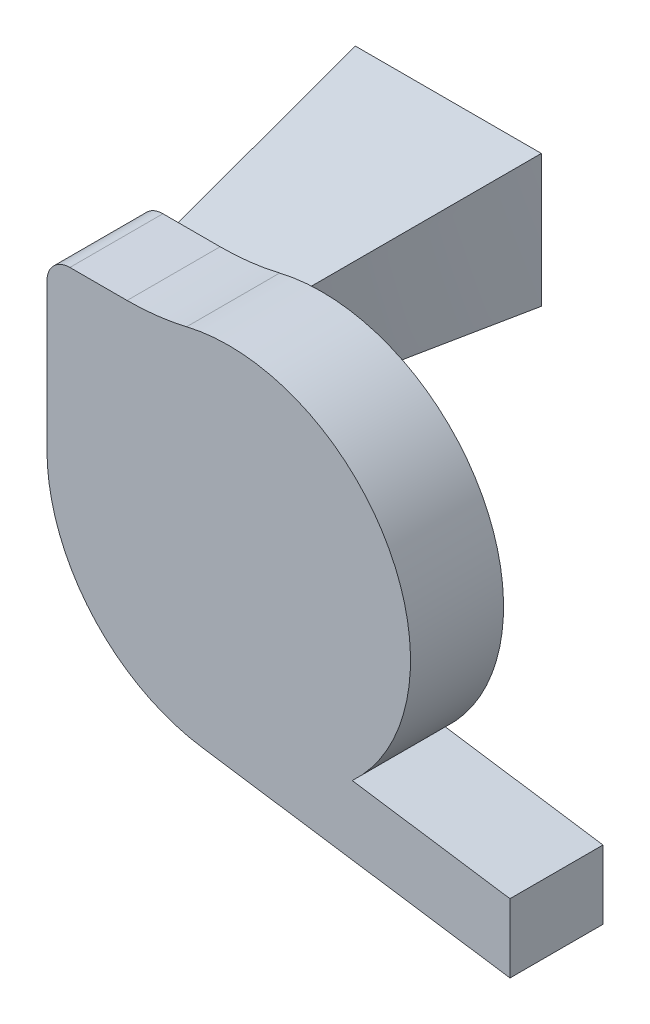
ISO-10303-21;
HEADER;
FILE_DESCRIPTION(('STEP AP214'),'2;1');
FILE_NAME('part.step','',(''),(''),'','','');
FILE_SCHEMA(('AUTOMOTIVE_DESIGN { 1 0 10303 214 1 1 1 1 }'));
ENDSEC;
DATA;
#1=APPLICATION_CONTEXT('core data for automotive mechanical design processes');
#2=APPLICATION_PROTOCOL_DEFINITION('international standard','automotive_design',2000,#1);
#3=PRODUCT_CONTEXT('',#1,'mechanical');
#4=PRODUCT('Part','Part','',(#3));
#5=PRODUCT_RELATED_PRODUCT_CATEGORY('part','',(#4));
#6=PRODUCT_DEFINITION_FORMATION('','',#4);
#7=PRODUCT_DEFINITION_CONTEXT('part definition',#1,'design');
#8=PRODUCT_DEFINITION('design','',#6,#7);
#9=PRODUCT_DEFINITION_SHAPE('','',#8);
#10=(LENGTH_UNIT() NAMED_UNIT(*) SI_UNIT(.MILLI.,.METRE.));
#11=(NAMED_UNIT(*) PLANE_ANGLE_UNIT() SI_UNIT($,.RADIAN.));
#12=(NAMED_UNIT(*) SI_UNIT($,.STERADIAN.) SOLID_ANGLE_UNIT());
#13=UNCERTAINTY_MEASURE_WITH_UNIT(LENGTH_MEASURE(1.E-05),#10,'distance_accuracy_value','');
#14=(GEOMETRIC_REPRESENTATION_CONTEXT(3) GLOBAL_UNCERTAINTY_ASSIGNED_CONTEXT((#13)) GLOBAL_UNIT_ASSIGNED_CONTEXT((#10,
#11,#12)) REPRESENTATION_CONTEXT('',''));
#15=CARTESIAN_POINT('',(0.,0.,0.));
#16=DIRECTION('',(0.,0.,1.));
#17=DIRECTION('',(1.,0.,0.));
#18=AXIS2_PLACEMENT_3D('',#15,#16,#17);
#19=CARTESIAN_POINT('',(128.,-103.,707.));
#20=DIRECTION('',(0.,0.,-1.));
#21=DIRECTION('',(-1.,0.,0.));
#22=AXIS2_PLACEMENT_3D('',#19,#20,#21);
#23=PLANE('',#22);
#24=DIRECTION('',(0.,-1.,0.));
#25=VECTOR('',#24,1.);
#26=CARTESIAN_POINT('',(521.006513991805,-418.097434556668,707.));
#27=LINE('',#26,#25);
#28=CARTESIAN_POINT('',(521.006513991806,-322.097434556668,707.));
#29=VERTEX_POINT('',#28);
#30=CARTESIAN_POINT('',(521.006513991805,-418.097434556668,707.));
#31=VERTEX_POINT('',#30);
#32=EDGE_CURVE('E267',#29,#31,#27,.T.);
#33=ORIENTED_EDGE('',*,*,#32,.T.);
#34=DIRECTION('',(-0.989169442590769,0.146778110918038,0.));
#35=VECTOR('',#34,1.);
#36=CARTESIAN_POINT('',(90.7183598268185,-354.249038418055,707.));
#37=LINE('',#36,#35);
#38=CARTESIAN_POINT('',(90.7183598268185,-354.249038418055,707.));
#39=VERTEX_POINT('',#38);
#40=EDGE_CURVE('E271',#31,#39,#37,.T.);
#41=ORIENTED_EDGE('',*,*,#40,.T.);
#42=CARTESIAN_POINT('',(128.,-103.,707.));
#43=DIRECTION('',(0.,0.,-1.));
#44=DIRECTION('',(-1.,0.,0.));
#45=AXIS2_PLACEMENT_3D('',#42,#43,#44);
#46=CIRCLE('',#45,254.);
#47=CARTESIAN_POINT('',(-126.,-103.,707.));
#48=VERTEX_POINT('',#47);
#49=EDGE_CURVE('E276',#39,#48,#46,.T.);
#50=ORIENTED_EDGE('',*,*,#49,.T.);
#51=DIRECTION('',(0.,1.,0.));
#52=VECTOR('',#51,1.);
#53=CARTESIAN_POINT('',(-126.,-103.,707.));
#54=LINE('',#53,#52);
#55=CARTESIAN_POINT('',(-126.,102.31037281145,707.));
#56=VERTEX_POINT('',#55);
#57=EDGE_CURVE('E280',#48,#56,#54,.T.);
#58=ORIENTED_EDGE('',*,*,#57,.T.);
#59=CARTESIAN_POINT('',(-94.,102.31037281145,707.));
#60=DIRECTION('',(0.,0.,-1.));
#61=DIRECTION('',(-1.,0.,0.));
#62=AXIS2_PLACEMENT_3D('',#59,#60,#61);
#63=CIRCLE('',#62,32.);
#64=CARTESIAN_POINT('',(-94.,134.31037281145,707.));
#65=VERTEX_POINT('',#64);
#66=EDGE_CURVE('E284',#56,#65,#63,.T.);
#67=ORIENTED_EDGE('',*,*,#66,.T.);
#68=DIRECTION('',(1.,0.,0.));
#69=VECTOR('',#68,1.);
#70=CARTESIAN_POINT('',(-94.,134.31037281145,707.));
#71=LINE('',#70,#69);
#72=CARTESIAN_POINT('',(-14.0739402088401,134.31037281145,707.));
#73=VERTEX_POINT('',#72);
#74=EDGE_CURVE('E288',#65,#73,#71,.T.);
#75=ORIENTED_EDGE('',*,*,#74,.T.);
#76=CARTESIAN_POINT('',(-14.07394020884,493.372243845825,707.));
#77=DIRECTION('',(0.,0.,1.));
#78=DIRECTION('',(1.,0.,0.));
#79=AXIS2_PLACEMENT_3D('',#76,#77,#78);
#80=CIRCLE('',#79,359.061871034375);
#81=CARTESIAN_POINT('',(69.1368044270006,144.08525695989,707.));
#82=VERTEX_POINT('',#81);
#83=EDGE_CURVE('E292',#73,#82,#80,.T.);
#84=ORIENTED_EDGE('',*,*,#83,.T.);
#85=CARTESIAN_POINT('',(128.,-103.,707.));
#86=DIRECTION('',(0.,0.,-1.));
#87=DIRECTION('',(-1.,0.,0.));
#88=AXIS2_PLACEMENT_3D('',#85,#86,#87);
#89=CIRCLE('',#88,254.);
#90=CARTESIAN_POINT('',(300.557862014574,-289.386116052026,707.));
#91=VERTEX_POINT('',#90);
#92=EDGE_CURVE('E237',#82,#91,#89,.T.);
#93=ORIENTED_EDGE('',*,*,#92,.T.);
#94=DIRECTION('',(0.989169442590769,-0.146778110918038,0.));
#95=VECTOR('',#94,1.);
#96=CARTESIAN_POINT('',(521.006513991806,-322.097434556668,707.));
#97=LINE('',#96,#95);
#98=EDGE_CURVE('E297',#91,#29,#97,.T.);
#99=ORIENTED_EDGE('',*,*,#98,.T.);
#100=EDGE_LOOP('',(#33,#41,#50,#58,#67,#75,#84,#93,#99));
#101=FACE_BOUND('',#100,.T.);
#102=DIRECTION('',(-1.,0.,0.));
#103=VECTOR('',#102,1.);
#104=CARTESIAN_POINT('',(44.8216487915123,-38.2997440494397,707.));
#105=LINE('',#104,#103);
#106=CARTESIAN_POINT('',(44.8216487915123,-38.2997440494397,707.));
#107=VERTEX_POINT('',#106);
#108=CARTESIAN_POINT('',(-85.1783512084866,-38.2997440494397,707.));
#109=VERTEX_POINT('',#108);
#110=EDGE_CURVE('E320',#107,#109,#105,.T.);
#111=ORIENTED_EDGE('',*,*,#110,.F.);
#112=DIRECTION('',(-0.110431526074847,-0.993883734673619,0.));
#113=VECTOR('',#112,1.);
#114=CARTESIAN_POINT('',(44.8216487915123,-38.2997440494397,707.));
#115=LINE('',#114,#113);
#116=CARTESIAN_POINT('',(59.8216487915123,96.7002559505603,707.));
#117=VERTEX_POINT('',#116);
#118=EDGE_CURVE('E331',#117,#107,#115,.T.);
#119=ORIENTED_EDGE('',*,*,#118,.F.);
#120=DIRECTION('',(1.,0.,0.));
#121=VECTOR('',#120,1.);
#122=CARTESIAN_POINT('',(59.8216487915123,96.7002559505603,707.));
#123=LINE('',#122,#121);
#124=CARTESIAN_POINT('',(-100.178351208487,96.7002559505603,707.));
#125=VERTEX_POINT('',#124);
#126=EDGE_CURVE('E327',#125,#117,#123,.T.);
#127=ORIENTED_EDGE('',*,*,#126,.F.);
#128=DIRECTION('',(-0.110431526074846,0.993883734673619,0.));
#129=VECTOR('',#128,1.);
#130=CARTESIAN_POINT('',(-85.1783512084866,-38.2997440494397,707.));
#131=LINE('',#130,#129);
#132=EDGE_CURVE('E324',#109,#125,#131,.T.);
#133=ORIENTED_EDGE('',*,*,#132,.F.);
#134=EDGE_LOOP('',(#111,#119,#127,#133));
#135=FACE_BOUND('',#134,.T.);
#136=ADVANCED_FACE('F142',(#101,#135),#23,.T.);
#137=CARTESIAN_POINT('',(521.006513991805,-418.097434556668,837.));
#138=DIRECTION('',(1.,0.,0.));
#139=DIRECTION('',(0.,1.,0.));
#140=AXIS2_PLACEMENT_3D('',#137,#138,#139);
#141=PLANE('',#140);
#142=ORIENTED_EDGE('',*,*,#32,.F.);
#143=DIRECTION('',(0.,0.,-1.));
#144=VECTOR('',#143,1.);
#145=CARTESIAN_POINT('',(521.006513991806,-322.097434556668,837.));
#146=LINE('',#145,#144);
#147=CARTESIAN_POINT('',(521.006513991806,-322.097434556668,837.));
#148=VERTEX_POINT('',#147);
#149=EDGE_CURVE('E13',#148,#29,#146,.T.);
#150=ORIENTED_EDGE('',*,*,#149,.F.);
#151=DIRECTION('',(0.,-1.,0.));
#152=VECTOR('',#151,1.);
#153=CARTESIAN_POINT('',(521.006513991805,-418.097434556668,837.));
#154=LINE('',#153,#152);
#155=CARTESIAN_POINT('',(521.006513991805,-418.097434556668,837.));
#156=VERTEX_POINT('',#155);
#157=EDGE_CURVE('E300',#148,#156,#154,.T.);
#158=ORIENTED_EDGE('',*,*,#157,.T.);
#159=DIRECTION('',(0.,0.,-1.));
#160=VECTOR('',#159,1.);
#161=CARTESIAN_POINT('',(521.006513991805,-418.097434556668,837.));
#162=LINE('',#161,#160);
#163=EDGE_CURVE('E209',#156,#31,#162,.T.);
#164=ORIENTED_EDGE('',*,*,#163,.T.);
#165=EDGE_LOOP('',(#142,#150,#158,#164));
#166=FACE_BOUND('',#165,.T.);
#167=ADVANCED_FACE('F144',(#166),#141,.T.);
#168=CARTESIAN_POINT('',(521.006513991806,-322.097434556668,837.));
#169=DIRECTION('',(0.146778110918038,0.989169442590769,0.));
#170=DIRECTION('',(-0.989169442590769,0.146778110918038,0.));
#171=AXIS2_PLACEMENT_3D('',#168,#169,#170);
#172=PLANE('',#171);
#173=ORIENTED_EDGE('',*,*,#98,.F.);
#174=DIRECTION('',(0.,0.,-1.));
#175=VECTOR('',#174,1.);
#176=CARTESIAN_POINT('',(300.557862014574,-289.386116052026,837.));
#177=LINE('',#176,#175);
#178=CARTESIAN_POINT('',(300.557862014574,-289.386116052026,837.));
#179=VERTEX_POINT('',#178);
#180=EDGE_CURVE('E152',#179,#91,#177,.T.);
#181=ORIENTED_EDGE('',*,*,#180,.F.);
#182=DIRECTION('',(0.989169442590769,-0.146778110918038,0.));
#183=VECTOR('',#182,1.);
#184=CARTESIAN_POINT('',(521.006513991806,-322.097434556668,837.));
#185=LINE('',#184,#183);
#186=EDGE_CURVE('E251',#179,#148,#185,.T.);
#187=ORIENTED_EDGE('',*,*,#186,.T.);
#188=ORIENTED_EDGE('',*,*,#149,.T.);
#189=EDGE_LOOP('',(#173,#181,#187,#188));
#190=FACE_BOUND('',#189,.T.);
#191=ADVANCED_FACE('F514',(#190),#172,.T.);
#192=CARTESIAN_POINT('',(128.,-103.,837.));
#193=DIRECTION('',(0.,0.,-1.));
#194=DIRECTION('',(-1.,0.,0.));
#195=AXIS2_PLACEMENT_3D('',#192,#193,#194);
#196=CYLINDRICAL_SURFACE('',#195,254.);
#197=ORIENTED_EDGE('',*,*,#92,.F.);
#198=DIRECTION('',(0.,0.,-1.));
#199=VECTOR('',#198,1.);
#200=CARTESIAN_POINT('',(69.1368044270006,144.08525695989,837.));
#201=LINE('',#200,#199);
#202=CARTESIAN_POINT('',(69.1368044270006,144.08525695989,837.));
#203=VERTEX_POINT('',#202);
#204=EDGE_CURVE('E231',#203,#82,#201,.T.);
#205=ORIENTED_EDGE('',*,*,#204,.F.);
#206=CARTESIAN_POINT('',(128.,-103.,837.));
#207=DIRECTION('',(0.,0.,-1.));
#208=DIRECTION('',(-1.,0.,0.));
#209=AXIS2_PLACEMENT_3D('',#206,#207,#208);
#210=CIRCLE('',#209,254.);
#211=EDGE_CURVE('E234',#203,#179,#210,.T.);
#212=ORIENTED_EDGE('',*,*,#211,.T.);
#213=ORIENTED_EDGE('',*,*,#180,.T.);
#214=EDGE_LOOP('',(#197,#205,#212,#213));
#215=FACE_BOUND('',#214,.T.);
#216=ADVANCED_FACE('F233',(#215),#196,.T.);
#217=CARTESIAN_POINT('',(-14.07394020884,493.372243845825,837.));
#218=DIRECTION('',(0.,0.,-1.));
#219=DIRECTION('',(-1.,0.,0.));
#220=AXIS2_PLACEMENT_3D('',#217,#218,#219);
#221=CYLINDRICAL_SURFACE('',#220,359.061871034375);
#222=ORIENTED_EDGE('',*,*,#83,.F.);
#223=DIRECTION('',(0.,0.,-1.));
#224=VECTOR('',#223,1.);
#225=CARTESIAN_POINT('',(-14.0739402088401,134.31037281145,837.));
#226=LINE('',#225,#224);
#227=CARTESIAN_POINT('',(-14.0739402088401,134.31037281145,837.));
#228=VERTEX_POINT('',#227);
#229=EDGE_CURVE('E243',#228,#73,#226,.T.);
#230=ORIENTED_EDGE('',*,*,#229,.F.);
#231=CARTESIAN_POINT('',(-14.07394020884,493.372243845825,837.));
#232=DIRECTION('',(0.,0.,1.));
#233=DIRECTION('',(1.,0.,0.));
#234=AXIS2_PLACEMENT_3D('',#231,#232,#233);
#235=CIRCLE('',#234,359.061871034375);
#236=EDGE_CURVE('E249',#228,#203,#235,.T.);
#237=ORIENTED_EDGE('',*,*,#236,.T.);
#238=ORIENTED_EDGE('',*,*,#204,.T.);
#239=EDGE_LOOP('',(#222,#230,#237,#238));
#240=FACE_BOUND('',#239,.T.);
#241=ADVANCED_FACE('F254',(#240),#221,.F.);
#242=CARTESIAN_POINT('',(-94.,134.31037281145,837.));
#243=DIRECTION('',(0.,1.,0.));
#244=DIRECTION('',(-1.,0.,0.));
#245=AXIS2_PLACEMENT_3D('',#242,#243,#244);
#246=PLANE('',#245);
#247=ORIENTED_EDGE('',*,*,#74,.F.);
#248=DIRECTION('',(0.,0.,-1.));
#249=VECTOR('',#248,1.);
#250=CARTESIAN_POINT('',(-94.,134.31037281145,837.));
#251=LINE('',#250,#249);
#252=CARTESIAN_POINT('',(-94.,134.31037281145,837.));
#253=VERTEX_POINT('',#252);
#254=EDGE_CURVE('E306',#253,#65,#251,.T.);
#255=ORIENTED_EDGE('',*,*,#254,.F.);
#256=DIRECTION('',(1.,0.,0.));
#257=VECTOR('',#256,1.);
#258=CARTESIAN_POINT('',(-94.,134.31037281145,837.));
#259=LINE('',#258,#257);
#260=EDGE_CURVE('E256',#253,#228,#259,.T.);
#261=ORIENTED_EDGE('',*,*,#260,.T.);
#262=ORIENTED_EDGE('',*,*,#229,.T.);
#263=EDGE_LOOP('',(#247,#255,#261,#262));
#264=FACE_BOUND('',#263,.T.);
#265=ADVANCED_FACE('F516',(#264),#246,.T.);
#266=CARTESIAN_POINT('',(-94.,102.31037281145,837.));
#267=DIRECTION('',(0.,0.,-1.));
#268=DIRECTION('',(-1.,0.,0.));
#269=AXIS2_PLACEMENT_3D('',#266,#267,#268);
#270=CYLINDRICAL_SURFACE('',#269,32.);
#271=ORIENTED_EDGE('',*,*,#66,.F.);
#272=DIRECTION('',(0.,0.,-1.));
#273=VECTOR('',#272,1.);
#274=CARTESIAN_POINT('',(-126.,102.31037281145,837.));
#275=LINE('',#274,#273);
#276=CARTESIAN_POINT('',(-126.,102.31037281145,837.));
#277=VERTEX_POINT('',#276);
#278=EDGE_CURVE('E309',#277,#56,#275,.T.);
#279=ORIENTED_EDGE('',*,*,#278,.F.);
#280=CARTESIAN_POINT('',(-94.,102.31037281145,837.));
#281=DIRECTION('',(0.,0.,-1.));
#282=DIRECTION('',(-1.,0.,0.));
#283=AXIS2_PLACEMENT_3D('',#280,#281,#282);
#284=CIRCLE('',#283,32.);
#285=EDGE_CURVE('E261',#277,#253,#284,.T.);
#286=ORIENTED_EDGE('',*,*,#285,.T.);
#287=ORIENTED_EDGE('',*,*,#254,.T.);
#288=EDGE_LOOP('',(#271,#279,#286,#287));
#289=FACE_BOUND('',#288,.T.);
#290=ADVANCED_FACE('F502',(#289),#270,.T.);
#291=CARTESIAN_POINT('',(-126.,-103.,837.));
#292=DIRECTION('',(-1.,0.,0.));
#293=DIRECTION('',(0.,0.,1.));
#294=AXIS2_PLACEMENT_3D('',#291,#292,#293);
#295=PLANE('',#294);
#296=ORIENTED_EDGE('',*,*,#57,.F.);
#297=DIRECTION('',(0.,0.,-1.));
#298=VECTOR('',#297,1.);
#299=CARTESIAN_POINT('',(-126.,-103.,837.));
#300=LINE('',#299,#298);
#301=CARTESIAN_POINT('',(-126.,-103.,837.));
#302=VERTEX_POINT('',#301);
#303=EDGE_CURVE('E312',#302,#48,#300,.T.);
#304=ORIENTED_EDGE('',*,*,#303,.F.);
#305=DIRECTION('',(0.,1.,0.));
#306=VECTOR('',#305,1.);
#307=CARTESIAN_POINT('',(-126.,-103.,837.));
#308=LINE('',#307,#306);
#309=EDGE_CURVE('E493',#302,#277,#308,.T.);
#310=ORIENTED_EDGE('',*,*,#309,.T.);
#311=ORIENTED_EDGE('',*,*,#278,.T.);
#312=EDGE_LOOP('',(#296,#304,#310,#311));
#313=FACE_BOUND('',#312,.T.);
#314=ADVANCED_FACE('F508',(#313),#295,.T.);
#315=CARTESIAN_POINT('',(128.,-103.,837.));
#316=DIRECTION('',(0.,0.,-1.));
#317=DIRECTION('',(-1.,0.,0.));
#318=AXIS2_PLACEMENT_3D('',#315,#316,#317);
#319=CYLINDRICAL_SURFACE('',#318,254.);
#320=ORIENTED_EDGE('',*,*,#49,.F.);
#321=DIRECTION('',(0.,0.,-1.));
#322=VECTOR('',#321,1.);
#323=CARTESIAN_POINT('',(90.7183598268185,-354.249038418055,837.));
#324=LINE('',#323,#322);
#325=CARTESIAN_POINT('',(90.7183598268185,-354.249038418055,837.));
#326=VERTEX_POINT('',#325);
#327=EDGE_CURVE('E315',#326,#39,#324,.T.);
#328=ORIENTED_EDGE('',*,*,#327,.F.);
#329=CARTESIAN_POINT('',(128.,-103.,837.));
#330=DIRECTION('',(0.,0.,-1.));
#331=DIRECTION('',(-1.,0.,0.));
#332=AXIS2_PLACEMENT_3D('',#329,#330,#331);
#333=CIRCLE('',#332,254.);
#334=EDGE_CURVE('E489',#326,#302,#333,.T.);
#335=ORIENTED_EDGE('',*,*,#334,.T.);
#336=ORIENTED_EDGE('',*,*,#303,.T.);
#337=EDGE_LOOP('',(#320,#328,#335,#336));
#338=FACE_BOUND('',#337,.T.);
#339=ADVANCED_FACE('F511',(#338),#319,.T.);
#340=CARTESIAN_POINT('',(90.7183598268185,-354.249038418055,837.));
#341=DIRECTION('',(-0.146778110918038,-0.989169442590769,0.));
#342=DIRECTION('',(0.989169442590769,-0.146778110918038,0.));
#343=AXIS2_PLACEMENT_3D('',#340,#341,#342);
#344=PLANE('',#343);
#345=ORIENTED_EDGE('',*,*,#40,.F.);
#346=ORIENTED_EDGE('',*,*,#163,.F.);
#347=DIRECTION('',(-0.989169442590769,0.146778110918038,0.));
#348=VECTOR('',#347,1.);
#349=CARTESIAN_POINT('',(90.7183598268185,-354.249038418055,837.));
#350=LINE('',#349,#348);
#351=EDGE_CURVE('E486',#156,#326,#350,.T.);
#352=ORIENTED_EDGE('',*,*,#351,.T.);
#353=ORIENTED_EDGE('',*,*,#327,.T.);
#354=EDGE_LOOP('',(#345,#346,#352,#353));
#355=FACE_BOUND('',#354,.T.);
#356=ADVANCED_FACE('F512',(#355),#344,.T.);
#357=CARTESIAN_POINT('',(128.,-103.,837.));
#358=DIRECTION('',(0.,0.,-1.));
#359=DIRECTION('',(-1.,0.,0.));
#360=AXIS2_PLACEMENT_3D('',#357,#358,#359);
#361=PLANE('',#360);
#362=ORIENTED_EDGE('',*,*,#157,.F.);
#363=ORIENTED_EDGE('',*,*,#186,.F.);
#364=ORIENTED_EDGE('',*,*,#211,.F.);
#365=ORIENTED_EDGE('',*,*,#236,.F.);
#366=ORIENTED_EDGE('',*,*,#260,.F.);
#367=ORIENTED_EDGE('',*,*,#285,.F.);
#368=ORIENTED_EDGE('',*,*,#309,.F.);
#369=ORIENTED_EDGE('',*,*,#334,.F.);
#370=ORIENTED_EDGE('',*,*,#351,.F.);
#371=EDGE_LOOP('',(#362,#363,#364,#365,#366,#367,#368,#369,#370));
#372=FACE_BOUND('',#371,.T.);
#373=ADVANCED_FACE('F247',(#372),#361,.F.);
#374=CARTESIAN_POINT('',(128.,-103.,382.));
#375=DIRECTION('',(0.,0.,1.));
#376=DIRECTION('',(1.,0.,0.));
#377=AXIS2_PLACEMENT_3D('',#374,#375,#376);
#378=PLANE('',#377);
#379=DIRECTION('',(0.,-1.,0.));
#380=VECTOR('',#379,1.);
#381=CARTESIAN_POINT('',(109.821648791513,-38.2997440494397,382.));
#382=LINE('',#381,#380);
#383=CARTESIAN_POINT('',(109.821648791513,146.70025595056,382.));
#384=VERTEX_POINT('',#383);
#385=CARTESIAN_POINT('',(109.821648791513,-38.2997440494397,382.));
#386=VERTEX_POINT('',#385);
#387=EDGE_CURVE('E377',#384,#386,#382,.T.);
#388=ORIENTED_EDGE('',*,*,#387,.T.);
#389=DIRECTION('',(-1.,0.,0.));
#390=VECTOR('',#389,1.);
#391=CARTESIAN_POINT('',(109.821648791513,-38.2997440494397,382.));
#392=LINE('',#391,#390);
#393=CARTESIAN_POINT('',(-150.178351208487,-38.2997440494397,382.));
#394=VERTEX_POINT('',#393);
#395=EDGE_CURVE('E272',#386,#394,#392,.T.);
#396=ORIENTED_EDGE('',*,*,#395,.T.);
#397=DIRECTION('',(0.,1.,0.));
#398=VECTOR('',#397,1.);
#399=CARTESIAN_POINT('',(-150.178351208487,146.70025595056,382.));
#400=LINE('',#399,#398);
#401=CARTESIAN_POINT('',(-150.178351208487,146.70025595056,382.));
#402=VERTEX_POINT('',#401);
#403=EDGE_CURVE('E435',#394,#402,#400,.T.);
#404=ORIENTED_EDGE('',*,*,#403,.T.);
#405=DIRECTION('',(1.,0.,0.));
#406=VECTOR('',#405,1.);
#407=CARTESIAN_POINT('',(109.821648791513,146.70025595056,382.));
#408=LINE('',#407,#406);
#409=EDGE_CURVE('E365',#402,#384,#408,.T.);
#410=ORIENTED_EDGE('',*,*,#409,.T.);
#411=EDGE_LOOP('',(#388,#396,#404,#410));
#412=FACE_BOUND('',#411,.T.);
#413=ADVANCED_FACE('F404',(#412),#378,.F.);
#414=CARTESIAN_POINT('',(128.,-38.2997440494397,731.));
#415=DIRECTION('',(0.,1.,0.));
#416=DIRECTION('',(-1.,0.,0.));
#417=AXIS2_PLACEMENT_3D('',#414,#415,#416);
#418=PLANE('',#417);
#419=DIRECTION('',(-0.196116135138186,0.,-0.98058067569092));
#420=VECTOR('',#419,1.);
#421=CARTESIAN_POINT('',(-85.1783512084866,-38.2997440494397,707.));
#422=LINE('',#421,#420);
#423=EDGE_CURVE('E323',#109,#394,#422,.T.);
#424=ORIENTED_EDGE('',*,*,#423,.T.);
#425=ORIENTED_EDGE('',*,*,#395,.F.);
#426=DIRECTION('',(0.196116135138186,0.,-0.98058067569092));
#427=VECTOR('',#426,1.);
#428=CARTESIAN_POINT('',(44.8216487915123,-38.2997440494397,707.));
#429=LINE('',#428,#427);
#430=EDGE_CURVE('E160',#107,#386,#429,.T.);
#431=ORIENTED_EDGE('',*,*,#430,.F.);
#432=ORIENTED_EDGE('',*,*,#110,.T.);
#433=EDGE_LOOP('',(#424,#425,#431,#432));
#434=FACE_BOUND('',#433,.T.);
#435=ADVANCED_FACE('F395',(#434),#418,.F.);
#436=CARTESIAN_POINT('',(59.8216487915123,96.7002559505603,707.));
#437=CARTESIAN_POINT('',(109.821648791513,146.70025595056,382.));
#438=CARTESIAN_POINT('',(57.3216487915123,74.2002559505603,707.));
#439=CARTESIAN_POINT('',(109.821648791513,115.866922617227,382.));
#440=CARTESIAN_POINT('',(54.8216487915123,51.7002559505603,707.));
#441=CARTESIAN_POINT('',(109.821648791513,85.0335892838936,382.));
#442=CARTESIAN_POINT('',(49.8216487915123,6.70025595056026,707.));
#443=CARTESIAN_POINT('',(109.821648791513,23.3669226172269,382.));
#444=CARTESIAN_POINT('',(47.3216487915123,-15.7997440494397,707.));
#445=CARTESIAN_POINT('',(109.821648791513,-7.46641071610643,382.));
#446=CARTESIAN_POINT('',(44.8216487915123,-38.2997440494397,707.));
#447=CARTESIAN_POINT('',(109.821648791513,-38.2997440494397,382.));
#448=B_SPLINE_SURFACE_WITH_KNOTS('',3,1,((#436,#437),(#438,#439),(#440,#441),(#442,#443),(#444,
#445),(#446,#447)),.UNSPECIFIED.,.F.,.F.,.F.,(4,2,4),(2,2),(0.,0.5,1.),(0.,1.),.UNSPECIFIED.);
#449=DIRECTION('',(0.150329205600567,0.150329205600566,-0.977139836403677));
#450=VECTOR('',#449,1.);
#451=CARTESIAN_POINT('',(59.8216487915123,96.7002559505603,707.));
#452=LINE('',#451,#450);
#453=EDGE_CURVE('E368',#117,#384,#452,.T.);
#454=ORIENTED_EDGE('',*,*,#118,.T.);
#455=ORIENTED_EDGE('',*,*,#430,.T.);
#456=ORIENTED_EDGE('',*,*,#387,.F.);
#457=ORIENTED_EDGE('',*,*,#453,.F.);
#458=EDGE_LOOP('',(#454,#455,#456,#457));
#459=FACE_BOUND('',#458,.T.);
#460=ADVANCED_FACE('F374',(#459),#448,.T.);
#461=CARTESIAN_POINT('',(-85.1783512084866,-38.2997440494397,707.));
#462=CARTESIAN_POINT('',(-150.178351208487,-38.2997440494397,382.));
#463=CARTESIAN_POINT('',(-87.6783512084865,-15.7997440494398,707.));
#464=CARTESIAN_POINT('',(-150.178351208487,-7.46641071610632,382.));
#465=CARTESIAN_POINT('',(-90.1783512084865,6.70025595056017,707.));
#466=CARTESIAN_POINT('',(-150.178351208487,23.3669226172271,382.));
#467=CARTESIAN_POINT('',(-95.1783512084866,51.7002559505602,707.));
#468=CARTESIAN_POINT('',(-150.178351208487,85.0335892838937,382.));
#469=CARTESIAN_POINT('',(-97.6783512084866,74.2002559505602,707.));
#470=CARTESIAN_POINT('',(-150.178351208487,115.866922617227,382.));
#471=CARTESIAN_POINT('',(-100.178351208487,96.7002559505603,707.));
#472=CARTESIAN_POINT('',(-150.178351208487,146.70025595056,382.));
#473=B_SPLINE_SURFACE_WITH_KNOTS('',3,1,((#461,#462),(#463,#464),(#465,#466),(#467,#468),(#469,
#470),(#471,#472)),.UNSPECIFIED.,.F.,.F.,.F.,(4,2,4),(2,2),(0.,0.5,1.),(0.,1.),.UNSPECIFIED.);
#474=DIRECTION('',(-0.150329205600568,0.150329205600566,-0.977139836403677));
#475=VECTOR('',#474,1.);
#476=CARTESIAN_POINT('',(-125.178351208487,121.70025595056,544.5));
#477=LINE('',#476,#475);
#478=EDGE_CURVE('E351',#125,#402,#477,.T.);
#479=ORIENTED_EDGE('',*,*,#132,.T.);
#480=ORIENTED_EDGE('',*,*,#478,.T.);
#481=ORIENTED_EDGE('',*,*,#403,.F.);
#482=ORIENTED_EDGE('',*,*,#423,.F.);
#483=EDGE_LOOP('',(#479,#480,#481,#482));
#484=FACE_BOUND('',#483,.T.);
#485=ADVANCED_FACE('F348',(#484),#473,.T.);
#486=CARTESIAN_POINT('',(128.,88.4759725759809,760.457841934766));
#487=DIRECTION('',(0.,-0.988371697650617,-0.152057184253941));
#488=DIRECTION('',(0.,0.152057184253941,-0.988371697650617));
#489=AXIS2_PLACEMENT_3D('',#486,#487,#488);
#490=PLANE('',#489);
#491=ORIENTED_EDGE('',*,*,#453,.T.);
#492=ORIENTED_EDGE('',*,*,#409,.F.);
#493=ORIENTED_EDGE('',*,*,#478,.F.);
#494=ORIENTED_EDGE('',*,*,#126,.T.);
#495=EDGE_LOOP('',(#491,#492,#493,#494));
#496=FACE_BOUND('',#495,.T.);
#497=ADVANCED_FACE('F362',(#496),#490,.F.);
#498=CLOSED_SHELL('',(#136,#167,#191,#216,#241,#265,#290,#314,#339,#356,#373,#413,#435,#460,
#485,#497));
#499=MANIFOLD_SOLID_BREP('B2',#498);
#500=ADVANCED_BREP_SHAPE_REPRESENTATION('',(#18,#499),#14);
#501=SHAPE_DEFINITION_REPRESENTATION(#9,#500);
ENDSEC;
END-ISO-10303-21;
